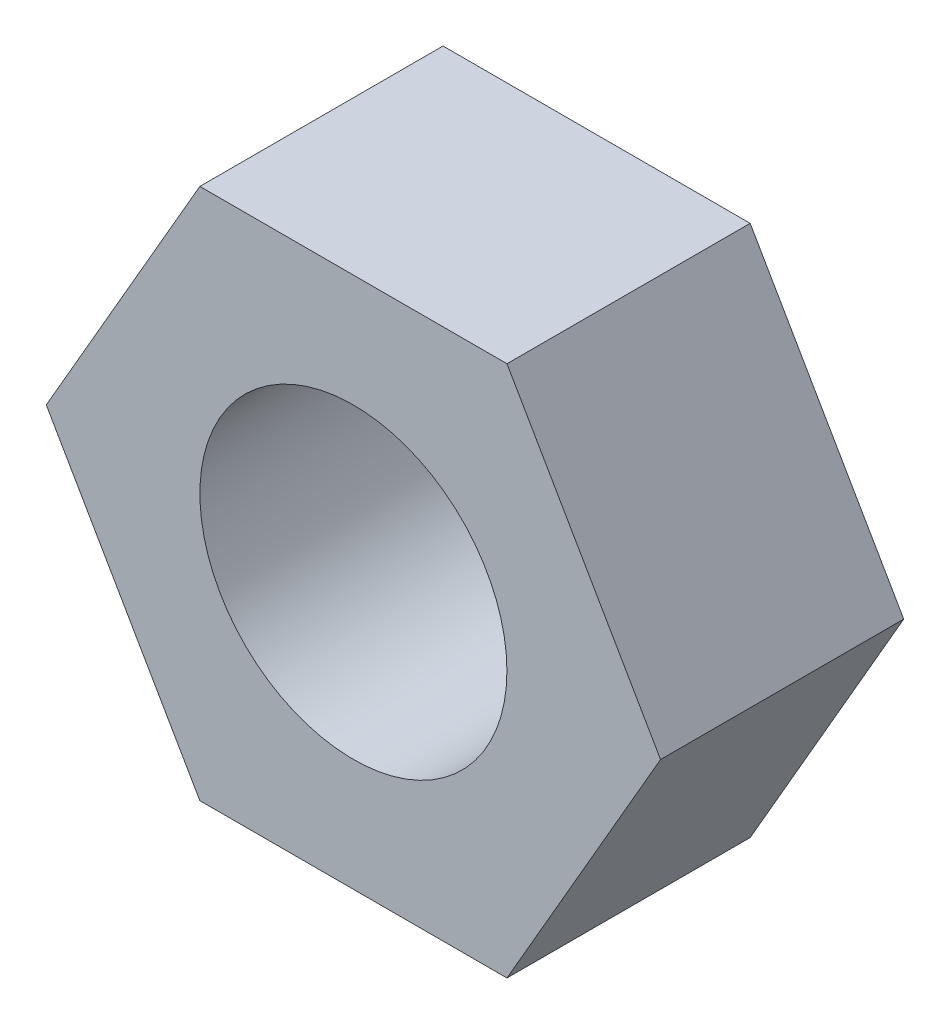
ISO-10303-21;
HEADER;
FILE_DESCRIPTION(('STEP AP214'),'2;1');
FILE_NAME('part.step','',(''),(''),'','','');
FILE_SCHEMA(('AUTOMOTIVE_DESIGN { 1 0 10303 214 1 1 1 1 }'));
ENDSEC;
DATA;
#1=APPLICATION_CONTEXT('core data for automotive mechanical design processes');
#2=APPLICATION_PROTOCOL_DEFINITION('international standard','automotive_design',2000,#1);
#3=PRODUCT_CONTEXT('',#1,'mechanical');
#4=PRODUCT('Part','Part','',(#3));
#5=PRODUCT_RELATED_PRODUCT_CATEGORY('part','',(#4));
#6=PRODUCT_DEFINITION_FORMATION('','',#4);
#7=PRODUCT_DEFINITION_CONTEXT('part definition',#1,'design');
#8=PRODUCT_DEFINITION('design','',#6,#7);
#9=PRODUCT_DEFINITION_SHAPE('','',#8);
#10=(LENGTH_UNIT() NAMED_UNIT(*) SI_UNIT(.MILLI.,.METRE.));
#11=(NAMED_UNIT(*) PLANE_ANGLE_UNIT() SI_UNIT($,.RADIAN.));
#12=(NAMED_UNIT(*) SI_UNIT($,.STERADIAN.) SOLID_ANGLE_UNIT());
#13=UNCERTAINTY_MEASURE_WITH_UNIT(LENGTH_MEASURE(1.E-05),#10,'distance_accuracy_value','');
#14=(GEOMETRIC_REPRESENTATION_CONTEXT(3) GLOBAL_UNCERTAINTY_ASSIGNED_CONTEXT((#13)) GLOBAL_UNIT_ASSIGNED_CONTEXT((#10,
#11,#12)) REPRESENTATION_CONTEXT('',''));
#15=CARTESIAN_POINT('',(0.,0.,0.));
#16=DIRECTION('',(0.,0.,1.));
#17=DIRECTION('',(1.,0.,0.));
#18=AXIS2_PLACEMENT_3D('',#15,#16,#17);
#19=CARTESIAN_POINT('',(2.02072594216369,-3.5,3.2));
#20=DIRECTION('',(-0.866025403784439,0.5,0.));
#21=DIRECTION('',(-0.5,-0.866025403784439,0.));
#22=AXIS2_PLACEMENT_3D('',#19,#20,#21);
#23=PLANE('',#22);
#24=DIRECTION('',(0.5,0.866025403784439,0.));
#25=VECTOR('',#24,1.);
#26=CARTESIAN_POINT('',(2.02072594216369,-3.5,0.));
#27=LINE('',#26,#25);
#28=CARTESIAN_POINT('',(2.02072594216369,-3.5,0.));
#29=VERTEX_POINT('',#28);
#30=CARTESIAN_POINT('',(4.04145188432738,0.,0.));
#31=VERTEX_POINT('',#30);
#32=EDGE_CURVE('E128',#29,#31,#27,.T.);
#33=ORIENTED_EDGE('',*,*,#32,.T.);
#34=DIRECTION('',(0.,0.,-1.));
#35=VECTOR('',#34,1.);
#36=CARTESIAN_POINT('',(4.04145188432738,0.,3.2));
#37=LINE('',#36,#35);
#38=CARTESIAN_POINT('',(4.04145188432738,0.,3.2));
#39=VERTEX_POINT('',#38);
#40=EDGE_CURVE('E11',#39,#31,#37,.T.);
#41=ORIENTED_EDGE('',*,*,#40,.F.);
#42=DIRECTION('',(0.5,0.866025403784439,0.));
#43=VECTOR('',#42,1.);
#44=CARTESIAN_POINT('',(2.02072594216369,-3.5,3.2));
#45=LINE('',#44,#43);
#46=CARTESIAN_POINT('',(2.02072594216369,-3.5,3.2));
#47=VERTEX_POINT('',#46);
#48=EDGE_CURVE('E139',#47,#39,#45,.T.);
#49=ORIENTED_EDGE('',*,*,#48,.F.);
#50=DIRECTION('',(0.,0.,-1.));
#51=VECTOR('',#50,1.);
#52=CARTESIAN_POINT('',(2.02072594216369,-3.5,3.2));
#53=LINE('',#52,#51);
#54=EDGE_CURVE('E124',#47,#29,#53,.T.);
#55=ORIENTED_EDGE('',*,*,#54,.T.);
#56=EDGE_LOOP('',(#33,#41,#49,#55));
#57=FACE_BOUND('',#56,.T.);
#58=ADVANCED_FACE('F43',(#57),#23,.F.);
#59=CARTESIAN_POINT('',(4.04145188432738,0.,3.2));
#60=DIRECTION('',(-0.866025403784439,-0.5,0.));
#61=DIRECTION('',(0.5,-0.866025403784439,0.));
#62=AXIS2_PLACEMENT_3D('',#59,#60,#61);
#63=PLANE('',#62);
#64=DIRECTION('',(-0.5,0.866025403784439,0.));
#65=VECTOR('',#64,1.);
#66=CARTESIAN_POINT('',(4.04145188432738,0.,0.));
#67=LINE('',#66,#65);
#68=CARTESIAN_POINT('',(2.02072594216369,3.5,0.));
#69=VERTEX_POINT('',#68);
#70=EDGE_CURVE('E131',#31,#69,#67,.T.);
#71=ORIENTED_EDGE('',*,*,#70,.T.);
#72=DIRECTION('',(0.,0.,-1.));
#73=VECTOR('',#72,1.);
#74=CARTESIAN_POINT('',(2.02072594216369,3.5,3.2));
#75=LINE('',#74,#73);
#76=CARTESIAN_POINT('',(2.02072594216369,3.5,3.2));
#77=VERTEX_POINT('',#76);
#78=EDGE_CURVE('E52',#77,#69,#75,.T.);
#79=ORIENTED_EDGE('',*,*,#78,.F.);
#80=DIRECTION('',(-0.5,0.866025403784439,0.));
#81=VECTOR('',#80,1.);
#82=CARTESIAN_POINT('',(4.04145188432738,0.,3.2));
#83=LINE('',#82,#81);
#84=EDGE_CURVE('E97',#39,#77,#83,.T.);
#85=ORIENTED_EDGE('',*,*,#84,.F.);
#86=ORIENTED_EDGE('',*,*,#40,.T.);
#87=EDGE_LOOP('',(#71,#79,#85,#86));
#88=FACE_BOUND('',#87,.T.);
#89=ADVANCED_FACE('F165',(#88),#63,.F.);
#90=CARTESIAN_POINT('',(2.02072594216369,3.5,3.2));
#91=DIRECTION('',(0.,-1.,0.));
#92=DIRECTION('',(1.,0.,0.));
#93=AXIS2_PLACEMENT_3D('',#90,#91,#92);
#94=PLANE('',#93);
#95=DIRECTION('',(-1.,0.,0.));
#96=VECTOR('',#95,1.);
#97=CARTESIAN_POINT('',(2.02072594216369,3.5,0.));
#98=LINE('',#97,#96);
#99=CARTESIAN_POINT('',(-2.02072594216369,3.5,0.));
#100=VERTEX_POINT('',#99);
#101=EDGE_CURVE('E134',#69,#100,#98,.T.);
#102=ORIENTED_EDGE('',*,*,#101,.T.);
#103=DIRECTION('',(0.,0.,-1.));
#104=VECTOR('',#103,1.);
#105=CARTESIAN_POINT('',(-2.02072594216369,3.5,3.2));
#106=LINE('',#105,#104);
#107=CARTESIAN_POINT('',(-2.02072594216369,3.5,3.2));
#108=VERTEX_POINT('',#107);
#109=EDGE_CURVE('E119',#108,#100,#106,.T.);
#110=ORIENTED_EDGE('',*,*,#109,.F.);
#111=DIRECTION('',(-1.,0.,0.));
#112=VECTOR('',#111,1.);
#113=CARTESIAN_POINT('',(2.02072594216369,3.5,3.2));
#114=LINE('',#113,#112);
#115=EDGE_CURVE('E110',#77,#108,#114,.T.);
#116=ORIENTED_EDGE('',*,*,#115,.F.);
#117=ORIENTED_EDGE('',*,*,#78,.T.);
#118=EDGE_LOOP('',(#102,#110,#116,#117));
#119=FACE_BOUND('',#118,.T.);
#120=ADVANCED_FACE('F146',(#119),#94,.F.);
#121=CARTESIAN_POINT('',(-2.02072594216369,3.5,3.2));
#122=DIRECTION('',(0.866025403784438,-0.5,0.));
#123=DIRECTION('',(0.5,0.866025403784439,0.));
#124=AXIS2_PLACEMENT_3D('',#121,#122,#123);
#125=PLANE('',#124);
#126=DIRECTION('',(-0.5,-0.866025403784438,0.));
#127=VECTOR('',#126,1.);
#128=CARTESIAN_POINT('',(-2.02072594216369,3.5,0.));
#129=LINE('',#128,#127);
#130=CARTESIAN_POINT('',(-4.04145188432738,0.,0.));
#131=VERTEX_POINT('',#130);
#132=EDGE_CURVE('E118',#100,#131,#129,.T.);
#133=ORIENTED_EDGE('',*,*,#132,.T.);
#134=DIRECTION('',(0.,0.,-1.));
#135=VECTOR('',#134,1.);
#136=CARTESIAN_POINT('',(-4.04145188432738,0.,3.2));
#137=LINE('',#136,#135);
#138=CARTESIAN_POINT('',(-4.04145188432738,0.,3.2));
#139=VERTEX_POINT('',#138);
#140=EDGE_CURVE('E115',#139,#131,#137,.T.);
#141=ORIENTED_EDGE('',*,*,#140,.F.);
#142=DIRECTION('',(-0.5,-0.866025403784438,0.));
#143=VECTOR('',#142,1.);
#144=CARTESIAN_POINT('',(-2.02072594216369,3.5,3.2));
#145=LINE('',#144,#143);
#146=EDGE_CURVE('E104',#108,#139,#145,.T.);
#147=ORIENTED_EDGE('',*,*,#146,.F.);
#148=ORIENTED_EDGE('',*,*,#109,.T.);
#149=EDGE_LOOP('',(#133,#141,#147,#148));
#150=FACE_BOUND('',#149,.T.);
#151=ADVANCED_FACE('F116',(#150),#125,.F.);
#152=CARTESIAN_POINT('',(-4.04145188432738,0.,3.2));
#153=DIRECTION('',(0.866025403784439,0.5,0.));
#154=DIRECTION('',(-0.5,0.866025403784439,0.));
#155=AXIS2_PLACEMENT_3D('',#152,#153,#154);
#156=PLANE('',#155);
#157=DIRECTION('',(0.5,-0.866025403784439,0.));
#158=VECTOR('',#157,1.);
#159=CARTESIAN_POINT('',(-4.04145188432738,0.,0.));
#160=LINE('',#159,#158);
#161=CARTESIAN_POINT('',(-2.02072594216369,-3.5,0.));
#162=VERTEX_POINT('',#161);
#163=EDGE_CURVE('E83',#131,#162,#160,.T.);
#164=ORIENTED_EDGE('',*,*,#163,.T.);
#165=DIRECTION('',(0.,0.,-1.));
#166=VECTOR('',#165,1.);
#167=CARTESIAN_POINT('',(-2.02072594216369,-3.5,3.2));
#168=LINE('',#167,#166);
#169=CARTESIAN_POINT('',(-2.02072594216369,-3.5,3.2));
#170=VERTEX_POINT('',#169);
#171=EDGE_CURVE('E120',#170,#162,#168,.T.);
#172=ORIENTED_EDGE('',*,*,#171,.F.);
#173=DIRECTION('',(0.5,-0.866025403784439,0.));
#174=VECTOR('',#173,1.);
#175=CARTESIAN_POINT('',(-4.04145188432738,0.,3.2));
#176=LINE('',#175,#174);
#177=EDGE_CURVE('E108',#139,#170,#176,.T.);
#178=ORIENTED_EDGE('',*,*,#177,.F.);
#179=ORIENTED_EDGE('',*,*,#140,.T.);
#180=EDGE_LOOP('',(#164,#172,#178,#179));
#181=FACE_BOUND('',#180,.T.);
#182=ADVANCED_FACE('F122',(#181),#156,.F.);
#183=CARTESIAN_POINT('',(-2.02072594216369,-3.5,3.2));
#184=DIRECTION('',(0.,1.,0.));
#185=DIRECTION('',(-1.,0.,0.));
#186=AXIS2_PLACEMENT_3D('',#183,#184,#185);
#187=PLANE('',#186);
#188=DIRECTION('',(1.,0.,0.));
#189=VECTOR('',#188,1.);
#190=CARTESIAN_POINT('',(-2.02072594216369,-3.5,0.));
#191=LINE('',#190,#189);
#192=EDGE_CURVE('E89',#162,#29,#191,.T.);
#193=ORIENTED_EDGE('',*,*,#192,.T.);
#194=ORIENTED_EDGE('',*,*,#54,.F.);
#195=DIRECTION('',(1.,0.,0.));
#196=VECTOR('',#195,1.);
#197=CARTESIAN_POINT('',(-2.02072594216369,-3.5,3.2));
#198=LINE('',#197,#196);
#199=EDGE_CURVE('E60',#170,#47,#198,.T.);
#200=ORIENTED_EDGE('',*,*,#199,.F.);
#201=ORIENTED_EDGE('',*,*,#171,.T.);
#202=EDGE_LOOP('',(#193,#194,#200,#201));
#203=FACE_BOUND('',#202,.T.);
#204=ADVANCED_FACE('F153',(#203),#187,.F.);
#205=CARTESIAN_POINT('',(0.,0.,3.2));
#206=DIRECTION('',(0.,0.,1.));
#207=DIRECTION('',(1.,0.,0.));
#208=AXIS2_PLACEMENT_3D('',#205,#206,#207);
#209=PLANE('',#208);
#210=CARTESIAN_POINT('',(0.,0.,3.2));
#211=DIRECTION('',(0.,0.,1.));
#212=DIRECTION('',(1.,0.,0.));
#213=AXIS2_PLACEMENT_3D('',#210,#211,#212);
#214=CIRCLE('',#213,2.02);
#215=CARTESIAN_POINT('',(2.02,0.,3.2));
#216=VERTEX_POINT('',#215);
#217=EDGE_CURVE('E132',#216,#216,#214,.F.);
#218=ORIENTED_EDGE('',*,*,#217,.T.);
#219=EDGE_LOOP('',(#218));
#220=FACE_BOUND('',#219,.T.);
#221=ORIENTED_EDGE('',*,*,#48,.T.);
#222=ORIENTED_EDGE('',*,*,#84,.T.);
#223=ORIENTED_EDGE('',*,*,#115,.T.);
#224=ORIENTED_EDGE('',*,*,#146,.T.);
#225=ORIENTED_EDGE('',*,*,#177,.T.);
#226=ORIENTED_EDGE('',*,*,#199,.T.);
#227=EDGE_LOOP('',(#221,#222,#223,#224,#225,#226));
#228=FACE_BOUND('',#227,.T.);
#229=ADVANCED_FACE('F106',(#220,#228),#209,.T.);
#230=CARTESIAN_POINT('',(0.,0.,0.));
#231=DIRECTION('',(0.,0.,1.));
#232=DIRECTION('',(1.,0.,0.));
#233=AXIS2_PLACEMENT_3D('',#230,#231,#232);
#234=PLANE('',#233);
#235=CARTESIAN_POINT('',(0.,0.,0.));
#236=DIRECTION('',(0.,0.,1.));
#237=DIRECTION('',(1.,0.,0.));
#238=AXIS2_PLACEMENT_3D('',#235,#236,#237);
#239=CIRCLE('',#238,2.02);
#240=CARTESIAN_POINT('',(2.02,0.,0.));
#241=VERTEX_POINT('',#240);
#242=EDGE_CURVE('E46',#241,#241,#239,.F.);
#243=ORIENTED_EDGE('',*,*,#242,.F.);
#244=EDGE_LOOP('',(#243));
#245=FACE_BOUND('',#244,.T.);
#246=ORIENTED_EDGE('',*,*,#32,.F.);
#247=ORIENTED_EDGE('',*,*,#192,.F.);
#248=ORIENTED_EDGE('',*,*,#163,.F.);
#249=ORIENTED_EDGE('',*,*,#132,.F.);
#250=ORIENTED_EDGE('',*,*,#101,.F.);
#251=ORIENTED_EDGE('',*,*,#70,.F.);
#252=EDGE_LOOP('',(#246,#247,#248,#249,#250,#251));
#253=FACE_BOUND('',#252,.T.);
#254=ADVANCED_FACE('F149',(#245,#253),#234,.F.);
#255=CARTESIAN_POINT('',(0.,0.,4.2));
#256=DIRECTION('',(0.,0.,-1.));
#257=DIRECTION('',(-1.,0.,0.));
#258=AXIS2_PLACEMENT_3D('',#255,#256,#257);
#259=CYLINDRICAL_SURFACE('',#258,2.02);
#260=ORIENTED_EDGE('',*,*,#217,.F.);
#261=EDGE_LOOP('',(#260));
#262=FACE_BOUND('',#261,.T.);
#263=ORIENTED_EDGE('',*,*,#242,.T.);
#264=EDGE_LOOP('',(#263));
#265=FACE_BOUND('',#264,.T.);
#266=ADVANCED_FACE('F204',(#262,#265),#259,.F.);
#267=CLOSED_SHELL('',(#58,#89,#120,#151,#182,#204,#229,#254,#266));
#268=MANIFOLD_SOLID_BREP('B2',#267);
#269=ADVANCED_BREP_SHAPE_REPRESENTATION('',(#18,#268),#14);
#270=SHAPE_DEFINITION_REPRESENTATION(#9,#269);
ENDSEC;
END-ISO-10303-21;
